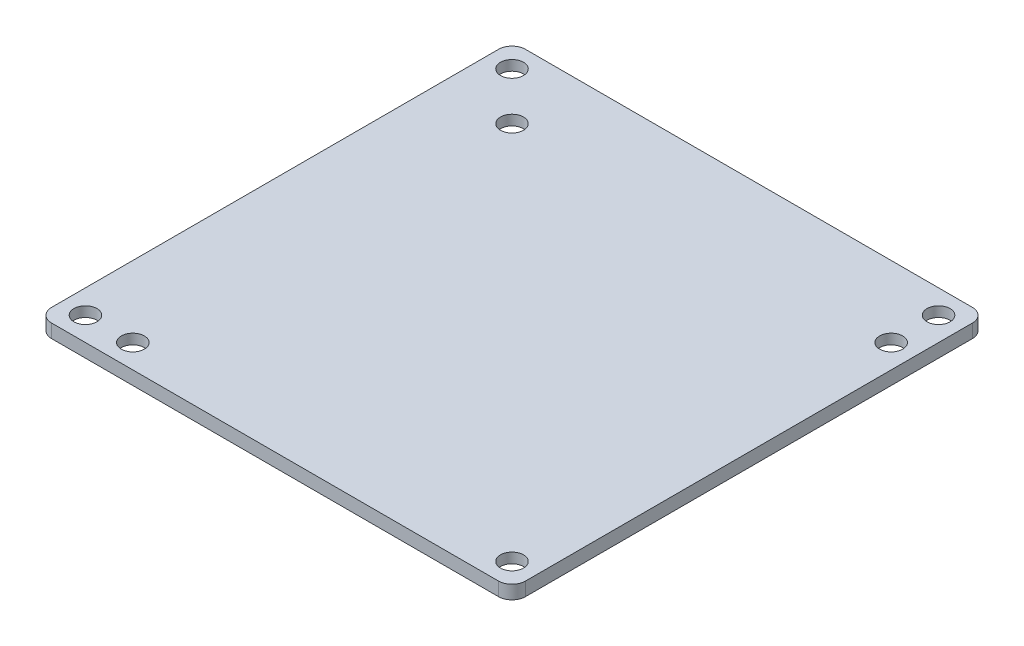
ISO-10303-21;
HEADER;
FILE_DESCRIPTION(('STEP AP214'),'2;1');
FILE_NAME('part.step','',(''),(''),'','','');
FILE_SCHEMA(('AUTOMOTIVE_DESIGN { 1 0 10303 214 1 1 1 1 }'));
ENDSEC;
DATA;
#1=APPLICATION_CONTEXT('core data for automotive mechanical design processes');
#2=APPLICATION_PROTOCOL_DEFINITION('international standard','automotive_design',2000,#1);
#3=PRODUCT_CONTEXT('',#1,'mechanical');
#4=PRODUCT('Part','Part','',(#3));
#5=PRODUCT_RELATED_PRODUCT_CATEGORY('part','',(#4));
#6=PRODUCT_DEFINITION_FORMATION('','',#4);
#7=PRODUCT_DEFINITION_CONTEXT('part definition',#1,'design');
#8=PRODUCT_DEFINITION('design','',#6,#7);
#9=PRODUCT_DEFINITION_SHAPE('','',#8);
#10=(LENGTH_UNIT() NAMED_UNIT(*) SI_UNIT(.MILLI.,.METRE.));
#11=(NAMED_UNIT(*) PLANE_ANGLE_UNIT() SI_UNIT($,.RADIAN.));
#12=(NAMED_UNIT(*) SI_UNIT($,.STERADIAN.) SOLID_ANGLE_UNIT());
#13=UNCERTAINTY_MEASURE_WITH_UNIT(LENGTH_MEASURE(1.E-05),#10,'distance_accuracy_value','');
#14=(GEOMETRIC_REPRESENTATION_CONTEXT(3) GLOBAL_UNCERTAINTY_ASSIGNED_CONTEXT((#13)) GLOBAL_UNIT_ASSIGNED_CONTEXT((#10,
#11,#12)) REPRESENTATION_CONTEXT('',''));
#15=CARTESIAN_POINT('',(0.,0.,0.));
#16=DIRECTION('',(0.,0.,1.));
#17=DIRECTION('',(1.,0.,0.));
#18=AXIS2_PLACEMENT_3D('',#15,#16,#17);
#19=CARTESIAN_POINT('',(-28.,2.,28.));
#20=DIRECTION('',(0.,-1.,0.));
#21=DIRECTION('',(0.,0.,-1.));
#22=AXIS2_PLACEMENT_3D('',#19,#20,#21);
#23=CYLINDRICAL_SURFACE('',#22,1.7);
#24=CARTESIAN_POINT('',(-28.,2.,28.));
#25=DIRECTION('',(0.,1.,0.));
#26=DIRECTION('',(0.,0.,1.));
#27=AXIS2_PLACEMENT_3D('',#24,#25,#26);
#28=CIRCLE('',#27,1.7);
#29=CARTESIAN_POINT('',(-28.,2.,29.7));
#30=VERTEX_POINT('',#29);
#31=EDGE_CURVE('E176',#30,#30,#28,.T.);
#32=ORIENTED_EDGE('',*,*,#31,.T.);
#33=EDGE_LOOP('',(#32));
#34=FACE_BOUND('',#33,.T.);
#35=CARTESIAN_POINT('',(-28.,0.5,28.));
#36=DIRECTION('',(0.,-1.,0.));
#37=DIRECTION('',(0.,0.,-1.));
#38=AXIS2_PLACEMENT_3D('',#35,#36,#37);
#39=CIRCLE('',#38,1.7);
#40=CARTESIAN_POINT('',(-28.,0.5,26.3));
#41=VERTEX_POINT('',#40);
#42=EDGE_CURVE('E207',#41,#41,#39,.F.);
#43=ORIENTED_EDGE('',*,*,#42,.F.);
#44=EDGE_LOOP('',(#43));
#45=FACE_BOUND('',#44,.T.);
#46=ADVANCED_FACE('F36',(#34,#45),#23,.F.);
#47=CARTESIAN_POINT('',(28.,2.,28.));
#48=DIRECTION('',(0.,-1.,0.));
#49=DIRECTION('',(0.,0.,-1.));
#50=AXIS2_PLACEMENT_3D('',#47,#48,#49);
#51=CYLINDRICAL_SURFACE('',#50,1.7);
#52=CARTESIAN_POINT('',(28.,2.,28.));
#53=DIRECTION('',(0.,1.,0.));
#54=DIRECTION('',(0.,0.,1.));
#55=AXIS2_PLACEMENT_3D('',#52,#53,#54);
#56=CIRCLE('',#55,1.7);
#57=CARTESIAN_POINT('',(28.,2.,29.7));
#58=VERTEX_POINT('',#57);
#59=EDGE_CURVE('E181',#58,#58,#56,.T.);
#60=ORIENTED_EDGE('',*,*,#59,.T.);
#61=EDGE_LOOP('',(#60));
#62=FACE_BOUND('',#61,.T.);
#63=CARTESIAN_POINT('',(28.,0.5,28.));
#64=DIRECTION('',(0.,-1.,0.));
#65=DIRECTION('',(0.,0.,-1.));
#66=AXIS2_PLACEMENT_3D('',#63,#64,#65);
#67=CIRCLE('',#66,1.7);
#68=CARTESIAN_POINT('',(28.,0.5,26.3));
#69=VERTEX_POINT('',#68);
#70=EDGE_CURVE('E235',#69,#69,#67,.F.);
#71=ORIENTED_EDGE('',*,*,#70,.F.);
#72=EDGE_LOOP('',(#71));
#73=FACE_BOUND('',#72,.T.);
#74=ADVANCED_FACE('F283',(#62,#73),#51,.F.);
#75=CARTESIAN_POINT('',(28.,2.,-28.));
#76=DIRECTION('',(0.,-1.,0.));
#77=DIRECTION('',(0.,0.,-1.));
#78=AXIS2_PLACEMENT_3D('',#75,#76,#77);
#79=CYLINDRICAL_SURFACE('',#78,1.7);
#80=CARTESIAN_POINT('',(28.,2.,-28.));
#81=DIRECTION('',(0.,1.,0.));
#82=DIRECTION('',(0.,0.,1.));
#83=AXIS2_PLACEMENT_3D('',#80,#81,#82);
#84=CIRCLE('',#83,1.7);
#85=CARTESIAN_POINT('',(28.,2.,-26.3));
#86=VERTEX_POINT('',#85);
#87=EDGE_CURVE('E185',#86,#86,#84,.T.);
#88=ORIENTED_EDGE('',*,*,#87,.T.);
#89=EDGE_LOOP('',(#88));
#90=FACE_BOUND('',#89,.T.);
#91=CARTESIAN_POINT('',(28.,0.5,-28.));
#92=DIRECTION('',(0.,-1.,0.));
#93=DIRECTION('',(0.,0.,-1.));
#94=AXIS2_PLACEMENT_3D('',#91,#92,#93);
#95=CIRCLE('',#94,1.7);
#96=CARTESIAN_POINT('',(28.,0.5,-29.7));
#97=VERTEX_POINT('',#96);
#98=EDGE_CURVE('E226',#97,#97,#95,.F.);
#99=ORIENTED_EDGE('',*,*,#98,.F.);
#100=EDGE_LOOP('',(#99));
#101=FACE_BOUND('',#100,.T.);
#102=ADVANCED_FACE('F273',(#90,#101),#79,.F.);
#103=CARTESIAN_POINT('',(-28.,2.,-28.));
#104=DIRECTION('',(0.,-1.,0.));
#105=DIRECTION('',(0.,0.,-1.));
#106=AXIS2_PLACEMENT_3D('',#103,#104,#105);
#107=CYLINDRICAL_SURFACE('',#106,1.7);
#108=CARTESIAN_POINT('',(-28.,2.,-28.));
#109=DIRECTION('',(0.,1.,0.));
#110=DIRECTION('',(0.,0.,1.));
#111=AXIS2_PLACEMENT_3D('',#108,#109,#110);
#112=CIRCLE('',#111,1.7);
#113=CARTESIAN_POINT('',(-28.,2.,-26.3));
#114=VERTEX_POINT('',#113);
#115=EDGE_CURVE('E189',#114,#114,#112,.T.);
#116=ORIENTED_EDGE('',*,*,#115,.T.);
#117=EDGE_LOOP('',(#116));
#118=FACE_BOUND('',#117,.T.);
#119=CARTESIAN_POINT('',(-28.,0.5,-28.));
#120=DIRECTION('',(0.,-1.,0.));
#121=DIRECTION('',(0.,0.,-1.));
#122=AXIS2_PLACEMENT_3D('',#119,#120,#121);
#123=CIRCLE('',#122,1.7);
#124=CARTESIAN_POINT('',(-28.,0.5,-29.7));
#125=VERTEX_POINT('',#124);
#126=EDGE_CURVE('E261',#125,#125,#123,.F.);
#127=ORIENTED_EDGE('',*,*,#126,.F.);
#128=EDGE_LOOP('',(#127));
#129=FACE_BOUND('',#128,.T.);
#130=ADVANCED_FACE('F270',(#118,#129),#107,.F.);
#131=CARTESIAN_POINT('',(28.,2.,-35.));
#132=DIRECTION('',(0.,-1.,0.));
#133=DIRECTION('',(0.,0.,-1.));
#134=AXIS2_PLACEMENT_3D('',#131,#132,#133);
#135=CYLINDRICAL_SURFACE('',#134,1.7);
#136=CARTESIAN_POINT('',(28.,2.,-35.));
#137=DIRECTION('',(0.,1.,0.));
#138=DIRECTION('',(0.,0.,1.));
#139=AXIS2_PLACEMENT_3D('',#136,#137,#138);
#140=CIRCLE('',#139,1.7);
#141=CARTESIAN_POINT('',(28.,2.,-33.3));
#142=VERTEX_POINT('',#141);
#143=EDGE_CURVE('E194',#142,#142,#140,.T.);
#144=ORIENTED_EDGE('',*,*,#143,.T.);
#145=EDGE_LOOP('',(#144));
#146=FACE_BOUND('',#145,.T.);
#147=CARTESIAN_POINT('',(28.,0.5,-35.));
#148=DIRECTION('',(0.,-1.,0.));
#149=DIRECTION('',(0.,0.,-1.));
#150=AXIS2_PLACEMENT_3D('',#147,#148,#149);
#151=CIRCLE('',#150,1.7);
#152=CARTESIAN_POINT('',(28.,0.5,-36.7));
#153=VERTEX_POINT('',#152);
#154=EDGE_CURVE('E216',#153,#153,#151,.F.);
#155=ORIENTED_EDGE('',*,*,#154,.F.);
#156=EDGE_LOOP('',(#155));
#157=FACE_BOUND('',#156,.T.);
#158=ADVANCED_FACE('F272',(#146,#157),#135,.F.);
#159=CARTESIAN_POINT('',(-35.,2.,28.));
#160=DIRECTION('',(0.,-1.,0.));
#161=DIRECTION('',(0.,0.,-1.));
#162=AXIS2_PLACEMENT_3D('',#159,#160,#161);
#163=CYLINDRICAL_SURFACE('',#162,1.7);
#164=CARTESIAN_POINT('',(-35.,2.,28.));
#165=DIRECTION('',(0.,1.,0.));
#166=DIRECTION('',(0.,0.,-1.));
#167=AXIS2_PLACEMENT_3D('',#164,#165,#166);
#168=CIRCLE('',#167,1.7);
#169=CARTESIAN_POINT('',(-35.,2.,26.3));
#170=VERTEX_POINT('',#169);
#171=EDGE_CURVE('E197',#170,#170,#168,.T.);
#172=ORIENTED_EDGE('',*,*,#171,.T.);
#173=EDGE_LOOP('',(#172));
#174=FACE_BOUND('',#173,.T.);
#175=CARTESIAN_POINT('',(-35.,0.5,28.));
#176=DIRECTION('',(0.,-1.,0.));
#177=DIRECTION('',(0.,0.,-1.));
#178=AXIS2_PLACEMENT_3D('',#175,#176,#177);
#179=CIRCLE('',#178,1.7);
#180=CARTESIAN_POINT('',(-35.,0.5,26.3));
#181=VERTEX_POINT('',#180);
#182=EDGE_CURVE('E244',#181,#181,#179,.F.);
#183=ORIENTED_EDGE('',*,*,#182,.F.);
#184=EDGE_LOOP('',(#183));
#185=FACE_BOUND('',#184,.T.);
#186=ADVANCED_FACE('F280',(#174,#185),#163,.F.);
#187=CARTESIAN_POINT('',(-35.,2.,-35.));
#188=DIRECTION('',(0.,-1.,0.));
#189=DIRECTION('',(0.,0.,-1.));
#190=AXIS2_PLACEMENT_3D('',#187,#188,#189);
#191=CYLINDRICAL_SURFACE('',#190,1.7);
#192=CARTESIAN_POINT('',(-35.,2.,-35.));
#193=DIRECTION('',(0.,1.,0.));
#194=DIRECTION('',(0.,0.,-1.));
#195=AXIS2_PLACEMENT_3D('',#192,#193,#194);
#196=CIRCLE('',#195,1.7);
#197=CARTESIAN_POINT('',(-35.,2.,-36.7));
#198=VERTEX_POINT('',#197);
#199=EDGE_CURVE('E200',#198,#198,#196,.T.);
#200=ORIENTED_EDGE('',*,*,#199,.T.);
#201=EDGE_LOOP('',(#200));
#202=FACE_BOUND('',#201,.T.);
#203=CARTESIAN_POINT('',(-35.,0.5,-35.));
#204=DIRECTION('',(0.,-1.,0.));
#205=DIRECTION('',(0.,0.,-1.));
#206=AXIS2_PLACEMENT_3D('',#203,#204,#205);
#207=CIRCLE('',#206,1.7);
#208=CARTESIAN_POINT('',(-35.,0.5,-36.7));
#209=VERTEX_POINT('',#208);
#210=EDGE_CURVE('E252',#209,#209,#207,.F.);
#211=ORIENTED_EDGE('',*,*,#210,.F.);
#212=EDGE_LOOP('',(#211));
#213=FACE_BOUND('',#212,.T.);
#214=ADVANCED_FACE('F297',(#202,#213),#191,.F.);
#215=CARTESIAN_POINT('',(0.,2.,0.));
#216=DIRECTION('',(0.,1.,0.));
#217=DIRECTION('',(0.,0.,1.));
#218=AXIS2_PLACEMENT_3D('',#215,#216,#217);
#219=PLANE('',#218);
#220=ORIENTED_EDGE('',*,*,#171,.F.);
#221=EDGE_LOOP('',(#220));
#222=FACE_BOUND('',#221,.T.);
#223=ORIENTED_EDGE('',*,*,#115,.F.);
#224=EDGE_LOOP('',(#223));
#225=FACE_BOUND('',#224,.T.);
#226=ORIENTED_EDGE('',*,*,#59,.F.);
#227=EDGE_LOOP('',(#226));
#228=FACE_BOUND('',#227,.T.);
#229=DIRECTION('',(1.,0.,0.));
#230=VECTOR('',#229,1.);
#231=CARTESIAN_POINT('',(-38.5,2.,31.5));
#232=LINE('',#231,#230);
#233=CARTESIAN_POINT('',(-36.5,2.,31.5));
#234=VERTEX_POINT('',#233);
#235=CARTESIAN_POINT('',(29.5,2.,31.5));
#236=VERTEX_POINT('',#235);
#237=EDGE_CURVE('E171',#234,#236,#232,.T.);
#238=ORIENTED_EDGE('',*,*,#237,.T.);
#239=CARTESIAN_POINT('',(29.5,2.,29.5));
#240=DIRECTION('',(0.,1.,0.));
#241=DIRECTION('',(0.,0.,1.));
#242=AXIS2_PLACEMENT_3D('',#239,#240,#241);
#243=CIRCLE('',#242,2.);
#244=CARTESIAN_POINT('',(31.5,2.,29.5));
#245=VERTEX_POINT('',#244);
#246=EDGE_CURVE('E149',#236,#245,#243,.T.);
#247=ORIENTED_EDGE('',*,*,#246,.T.);
#248=DIRECTION('',(0.,0.,-1.));
#249=VECTOR('',#248,1.);
#250=CARTESIAN_POINT('',(31.5,2.,-38.5));
#251=LINE('',#250,#249);
#252=CARTESIAN_POINT('',(31.5,2.,-36.5));
#253=VERTEX_POINT('',#252);
#254=EDGE_CURVE('E120',#245,#253,#251,.T.);
#255=ORIENTED_EDGE('',*,*,#254,.T.);
#256=CARTESIAN_POINT('',(29.5,2.,-36.5));
#257=DIRECTION('',(0.,1.,0.));
#258=DIRECTION('',(0.,0.,1.));
#259=AXIS2_PLACEMENT_3D('',#256,#257,#258);
#260=CIRCLE('',#259,2.);
#261=CARTESIAN_POINT('',(29.5,2.,-38.5));
#262=VERTEX_POINT('',#261);
#263=EDGE_CURVE('E56',#253,#262,#260,.T.);
#264=ORIENTED_EDGE('',*,*,#263,.T.);
#265=DIRECTION('',(-1.,0.,0.));
#266=VECTOR('',#265,1.);
#267=CARTESIAN_POINT('',(-38.5,2.,-38.5));
#268=LINE('',#267,#266);
#269=CARTESIAN_POINT('',(-36.5,2.,-38.5));
#270=VERTEX_POINT('',#269);
#271=EDGE_CURVE('E135',#262,#270,#268,.T.);
#272=ORIENTED_EDGE('',*,*,#271,.T.);
#273=CARTESIAN_POINT('',(-36.5,2.,-36.5));
#274=DIRECTION('',(0.,1.,0.));
#275=DIRECTION('',(0.,0.,1.));
#276=AXIS2_PLACEMENT_3D('',#273,#274,#275);
#277=CIRCLE('',#276,2.);
#278=CARTESIAN_POINT('',(-38.5,2.,-36.5));
#279=VERTEX_POINT('',#278);
#280=EDGE_CURVE('E145',#270,#279,#277,.T.);
#281=ORIENTED_EDGE('',*,*,#280,.T.);
#282=DIRECTION('',(0.,0.,1.));
#283=VECTOR('',#282,1.);
#284=CARTESIAN_POINT('',(-38.5,2.,-38.5));
#285=LINE('',#284,#283);
#286=CARTESIAN_POINT('',(-38.5,2.,29.5));
#287=VERTEX_POINT('',#286);
#288=EDGE_CURVE('E129',#279,#287,#285,.T.);
#289=ORIENTED_EDGE('',*,*,#288,.T.);
#290=CARTESIAN_POINT('',(-36.5,2.,29.5));
#291=DIRECTION('',(0.,1.,0.));
#292=DIRECTION('',(0.,0.,1.));
#293=AXIS2_PLACEMENT_3D('',#290,#291,#292);
#294=CIRCLE('',#293,2.);
#295=EDGE_CURVE('E147',#287,#234,#294,.T.);
#296=ORIENTED_EDGE('',*,*,#295,.T.);
#297=EDGE_LOOP('',(#238,#247,#255,#264,#272,#281,#289,#296));
#298=FACE_BOUND('',#297,.T.);
#299=ORIENTED_EDGE('',*,*,#31,.F.);
#300=EDGE_LOOP('',(#299));
#301=FACE_BOUND('',#300,.T.);
#302=ORIENTED_EDGE('',*,*,#87,.F.);
#303=EDGE_LOOP('',(#302));
#304=FACE_BOUND('',#303,.T.);
#305=ORIENTED_EDGE('',*,*,#143,.F.);
#306=EDGE_LOOP('',(#305));
#307=FACE_BOUND('',#306,.T.);
#308=ORIENTED_EDGE('',*,*,#199,.F.);
#309=EDGE_LOOP('',(#308));
#310=FACE_BOUND('',#309,.T.);
#311=ADVANCED_FACE('F294',(#222,#225,#228,#298,#301,#304,#307,#310),#219,.T.);
#312=CARTESIAN_POINT('',(0.,0.,0.));
#313=DIRECTION('',(0.,1.,0.));
#314=DIRECTION('',(0.,0.,1.));
#315=AXIS2_PLACEMENT_3D('',#312,#313,#314);
#316=PLANE('',#315);
#317=CARTESIAN_POINT('',(-35.,0.,28.));
#318=DIRECTION('',(0.,-1.,0.));
#319=DIRECTION('',(0.,0.,-1.));
#320=AXIS2_PLACEMENT_3D('',#317,#318,#319);
#321=CIRCLE('',#320,2.5);
#322=CARTESIAN_POINT('',(-35.,0.,25.5));
#323=VERTEX_POINT('',#322);
#324=EDGE_CURVE('E239',#323,#323,#321,.T.);
#325=ORIENTED_EDGE('',*,*,#324,.F.);
#326=EDGE_LOOP('',(#325));
#327=FACE_BOUND('',#326,.T.);
#328=CARTESIAN_POINT('',(28.,0.,28.));
#329=DIRECTION('',(0.,-1.,0.));
#330=DIRECTION('',(0.,0.,-1.));
#331=AXIS2_PLACEMENT_3D('',#328,#329,#330);
#332=CIRCLE('',#331,2.5);
#333=CARTESIAN_POINT('',(28.,0.,25.5));
#334=VERTEX_POINT('',#333);
#335=EDGE_CURVE('E230',#334,#334,#332,.T.);
#336=ORIENTED_EDGE('',*,*,#335,.F.);
#337=EDGE_LOOP('',(#336));
#338=FACE_BOUND('',#337,.T.);
#339=CARTESIAN_POINT('',(28.,0.,-28.));
#340=DIRECTION('',(0.,-1.,0.));
#341=DIRECTION('',(0.,0.,-1.));
#342=AXIS2_PLACEMENT_3D('',#339,#340,#341);
#343=CIRCLE('',#342,2.5);
#344=CARTESIAN_POINT('',(28.,0.,-30.5));
#345=VERTEX_POINT('',#344);
#346=EDGE_CURVE('E221',#345,#345,#343,.T.);
#347=ORIENTED_EDGE('',*,*,#346,.F.);
#348=EDGE_LOOP('',(#347));
#349=FACE_BOUND('',#348,.T.);
#350=CARTESIAN_POINT('',(28.,0.,-35.));
#351=DIRECTION('',(0.,-1.,0.));
#352=DIRECTION('',(0.,0.,-1.));
#353=AXIS2_PLACEMENT_3D('',#350,#351,#352);
#354=CIRCLE('',#353,2.5);
#355=CARTESIAN_POINT('',(28.,0.,-37.5));
#356=VERTEX_POINT('',#355);
#357=EDGE_CURVE('E213',#356,#356,#354,.T.);
#358=ORIENTED_EDGE('',*,*,#357,.F.);
#359=EDGE_LOOP('',(#358));
#360=FACE_BOUND('',#359,.T.);
#361=CARTESIAN_POINT('',(-28.,0.,-28.));
#362=DIRECTION('',(0.,-1.,0.));
#363=DIRECTION('',(0.,0.,-1.));
#364=AXIS2_PLACEMENT_3D('',#361,#362,#363);
#365=CIRCLE('',#364,2.5);
#366=CARTESIAN_POINT('',(-28.,0.,-30.5));
#367=VERTEX_POINT('',#366);
#368=EDGE_CURVE('E256',#367,#367,#365,.T.);
#369=ORIENTED_EDGE('',*,*,#368,.F.);
#370=EDGE_LOOP('',(#369));
#371=FACE_BOUND('',#370,.T.);
#372=CARTESIAN_POINT('',(-35.,0.,-35.));
#373=DIRECTION('',(0.,-1.,0.));
#374=DIRECTION('',(0.,0.,-1.));
#375=AXIS2_PLACEMENT_3D('',#372,#373,#374);
#376=CIRCLE('',#375,2.5);
#377=CARTESIAN_POINT('',(-35.,0.,-37.5));
#378=VERTEX_POINT('',#377);
#379=EDGE_CURVE('E249',#378,#378,#376,.T.);
#380=ORIENTED_EDGE('',*,*,#379,.F.);
#381=EDGE_LOOP('',(#380));
#382=FACE_BOUND('',#381,.T.);
#383=CARTESIAN_POINT('',(-28.,0.,28.));
#384=DIRECTION('',(0.,-1.,0.));
#385=DIRECTION('',(0.,0.,-1.));
#386=AXIS2_PLACEMENT_3D('',#383,#384,#385);
#387=CIRCLE('',#386,2.5);
#388=CARTESIAN_POINT('',(-28.,0.,25.5));
#389=VERTEX_POINT('',#388);
#390=EDGE_CURVE('E204',#389,#389,#387,.T.);
#391=ORIENTED_EDGE('',*,*,#390,.F.);
#392=EDGE_LOOP('',(#391));
#393=FACE_BOUND('',#392,.T.);
#394=DIRECTION('',(0.,0.,-1.));
#395=VECTOR('',#394,1.);
#396=CARTESIAN_POINT('',(31.5,0.,-38.5));
#397=LINE('',#396,#395);
#398=CARTESIAN_POINT('',(31.5,0.,29.5));
#399=VERTEX_POINT('',#398);
#400=CARTESIAN_POINT('',(31.5,0.,-36.5));
#401=VERTEX_POINT('',#400);
#402=EDGE_CURVE('E118',#399,#401,#397,.T.);
#403=ORIENTED_EDGE('',*,*,#402,.F.);
#404=CARTESIAN_POINT('',(29.5,0.,29.5));
#405=DIRECTION('',(0.,1.,0.));
#406=DIRECTION('',(0.,0.,1.));
#407=AXIS2_PLACEMENT_3D('',#404,#405,#406);
#408=CIRCLE('',#407,2.);
#409=CARTESIAN_POINT('',(29.5,0.,31.5));
#410=VERTEX_POINT('',#409);
#411=EDGE_CURVE('E101',#399,#410,#408,.F.);
#412=ORIENTED_EDGE('',*,*,#411,.T.);
#413=DIRECTION('',(1.,0.,0.));
#414=VECTOR('',#413,1.);
#415=CARTESIAN_POINT('',(-38.5,0.,31.5));
#416=LINE('',#415,#414);
#417=CARTESIAN_POINT('',(-36.5,0.,31.5));
#418=VERTEX_POINT('',#417);
#419=EDGE_CURVE('E127',#418,#410,#416,.T.);
#420=ORIENTED_EDGE('',*,*,#419,.F.);
#421=CARTESIAN_POINT('',(-36.5,0.,29.5));
#422=DIRECTION('',(0.,1.,0.));
#423=DIRECTION('',(0.,0.,1.));
#424=AXIS2_PLACEMENT_3D('',#421,#422,#423);
#425=CIRCLE('',#424,2.);
#426=CARTESIAN_POINT('',(-38.5,0.,29.5));
#427=VERTEX_POINT('',#426);
#428=EDGE_CURVE('E112',#418,#427,#425,.F.);
#429=ORIENTED_EDGE('',*,*,#428,.T.);
#430=DIRECTION('',(0.,0.,1.));
#431=VECTOR('',#430,1.);
#432=CARTESIAN_POINT('',(-38.5,0.,-38.5));
#433=LINE('',#432,#431);
#434=CARTESIAN_POINT('',(-38.5,0.,-36.5));
#435=VERTEX_POINT('',#434);
#436=EDGE_CURVE('E131',#435,#427,#433,.T.);
#437=ORIENTED_EDGE('',*,*,#436,.F.);
#438=CARTESIAN_POINT('',(-36.5,0.,-36.5));
#439=DIRECTION('',(0.,1.,0.));
#440=DIRECTION('',(0.,0.,1.));
#441=AXIS2_PLACEMENT_3D('',#438,#439,#440);
#442=CIRCLE('',#441,2.);
#443=CARTESIAN_POINT('',(-36.5,0.,-38.5));
#444=VERTEX_POINT('',#443);
#445=EDGE_CURVE('E138',#435,#444,#442,.F.);
#446=ORIENTED_EDGE('',*,*,#445,.T.);
#447=DIRECTION('',(-1.,0.,0.));
#448=VECTOR('',#447,1.);
#449=CARTESIAN_POINT('',(-38.5,0.,-38.5));
#450=LINE('',#449,#448);
#451=CARTESIAN_POINT('',(29.5,0.,-38.5));
#452=VERTEX_POINT('',#451);
#453=EDGE_CURVE('E126',#452,#444,#450,.T.);
#454=ORIENTED_EDGE('',*,*,#453,.F.);
#455=CARTESIAN_POINT('',(29.5,0.,-36.5));
#456=DIRECTION('',(0.,1.,0.));
#457=DIRECTION('',(0.,0.,1.));
#458=AXIS2_PLACEMENT_3D('',#455,#456,#457);
#459=CIRCLE('',#458,2.);
#460=EDGE_CURVE('E121',#452,#401,#459,.F.);
#461=ORIENTED_EDGE('',*,*,#460,.T.);
#462=EDGE_LOOP('',(#403,#412,#420,#429,#437,#446,#454,#461));
#463=FACE_BOUND('',#462,.T.);
#464=ADVANCED_FACE('F124',(#327,#338,#349,#360,#371,#382,#393,#463),#316,.F.);
#465=CARTESIAN_POINT('',(-38.5,2.,-38.5));
#466=DIRECTION('',(1.,0.,0.));
#467=DIRECTION('',(0.,0.,-1.));
#468=AXIS2_PLACEMENT_3D('',#465,#466,#467);
#469=PLANE('',#468);
#470=ORIENTED_EDGE('',*,*,#436,.T.);
#471=DIRECTION('',(0.,-1.,0.));
#472=VECTOR('',#471,1.);
#473=CARTESIAN_POINT('',(-38.5,2.,29.5));
#474=LINE('',#473,#472);
#475=EDGE_CURVE('E154',#427,#287,#474,.F.);
#476=ORIENTED_EDGE('',*,*,#475,.T.);
#477=ORIENTED_EDGE('',*,*,#288,.F.);
#478=DIRECTION('',(0.,-1.,0.));
#479=VECTOR('',#478,1.);
#480=CARTESIAN_POINT('',(-38.5,2.,-36.5));
#481=LINE('',#480,#479);
#482=EDGE_CURVE('E151',#279,#435,#481,.T.);
#483=ORIENTED_EDGE('',*,*,#482,.T.);
#484=EDGE_LOOP('',(#470,#476,#477,#483));
#485=FACE_BOUND('',#484,.T.);
#486=ADVANCED_FACE('F167',(#485),#469,.F.);
#487=CARTESIAN_POINT('',(-38.5,2.,31.5));
#488=DIRECTION('',(0.,0.,-1.));
#489=DIRECTION('',(-1.,0.,0.));
#490=AXIS2_PLACEMENT_3D('',#487,#488,#489);
#491=PLANE('',#490);
#492=ORIENTED_EDGE('',*,*,#419,.T.);
#493=DIRECTION('',(0.,-1.,0.));
#494=VECTOR('',#493,1.);
#495=CARTESIAN_POINT('',(29.5,2.,31.5));
#496=LINE('',#495,#494);
#497=EDGE_CURVE('E106',#410,#236,#496,.F.);
#498=ORIENTED_EDGE('',*,*,#497,.T.);
#499=ORIENTED_EDGE('',*,*,#237,.F.);
#500=DIRECTION('',(0.,-1.,0.));
#501=VECTOR('',#500,1.);
#502=CARTESIAN_POINT('',(-36.5,2.,31.5));
#503=LINE('',#502,#501);
#504=EDGE_CURVE('E111',#234,#418,#503,.T.);
#505=ORIENTED_EDGE('',*,*,#504,.T.);
#506=EDGE_LOOP('',(#492,#498,#499,#505));
#507=FACE_BOUND('',#506,.T.);
#508=ADVANCED_FACE('F306',(#507),#491,.F.);
#509=CARTESIAN_POINT('',(31.5,2.,-38.5));
#510=DIRECTION('',(-1.,0.,0.));
#511=DIRECTION('',(0.,0.,1.));
#512=AXIS2_PLACEMENT_3D('',#509,#510,#511);
#513=PLANE('',#512);
#514=ORIENTED_EDGE('',*,*,#254,.F.);
#515=DIRECTION('',(0.,-1.,0.));
#516=VECTOR('',#515,1.);
#517=CARTESIAN_POINT('',(31.5,2.,29.5));
#518=LINE('',#517,#516);
#519=EDGE_CURVE('E105',#245,#399,#518,.T.);
#520=ORIENTED_EDGE('',*,*,#519,.T.);
#521=ORIENTED_EDGE('',*,*,#402,.T.);
#522=DIRECTION('',(0.,-1.,0.));
#523=VECTOR('',#522,1.);
#524=CARTESIAN_POINT('',(31.5,2.,-36.5));
#525=LINE('',#524,#523);
#526=EDGE_CURVE('E122',#401,#253,#525,.F.);
#527=ORIENTED_EDGE('',*,*,#526,.T.);
#528=EDGE_LOOP('',(#514,#520,#521,#527));
#529=FACE_BOUND('',#528,.T.);
#530=ADVANCED_FACE('F117',(#529),#513,.F.);
#531=CARTESIAN_POINT('',(-38.5,2.,-38.5));
#532=DIRECTION('',(0.,0.,1.));
#533=DIRECTION('',(1.,0.,0.));
#534=AXIS2_PLACEMENT_3D('',#531,#532,#533);
#535=PLANE('',#534);
#536=ORIENTED_EDGE('',*,*,#453,.T.);
#537=DIRECTION('',(0.,-1.,0.));
#538=VECTOR('',#537,1.);
#539=CARTESIAN_POINT('',(-36.5,2.,-38.5));
#540=LINE('',#539,#538);
#541=EDGE_CURVE('E11',#444,#270,#540,.F.);
#542=ORIENTED_EDGE('',*,*,#541,.T.);
#543=ORIENTED_EDGE('',*,*,#271,.F.);
#544=DIRECTION('',(0.,-1.,0.));
#545=VECTOR('',#544,1.);
#546=CARTESIAN_POINT('',(29.5,2.,-38.5));
#547=LINE('',#546,#545);
#548=EDGE_CURVE('E44',#262,#452,#547,.T.);
#549=ORIENTED_EDGE('',*,*,#548,.T.);
#550=EDGE_LOOP('',(#536,#542,#543,#549));
#551=FACE_BOUND('',#550,.T.);
#552=ADVANCED_FACE('F157',(#551),#535,.F.);
#553=CARTESIAN_POINT('',(29.5,2.,29.5));
#554=DIRECTION('',(0.,-1.,0.));
#555=DIRECTION('',(0.,0.,-1.));
#556=AXIS2_PLACEMENT_3D('',#553,#554,#555);
#557=CYLINDRICAL_SURFACE('',#556,2.);
#558=ORIENTED_EDGE('',*,*,#246,.F.);
#559=ORIENTED_EDGE('',*,*,#497,.F.);
#560=ORIENTED_EDGE('',*,*,#411,.F.);
#561=ORIENTED_EDGE('',*,*,#519,.F.);
#562=EDGE_LOOP('',(#558,#559,#560,#561));
#563=FACE_BOUND('',#562,.T.);
#564=ADVANCED_FACE('F104',(#563),#557,.T.);
#565=CARTESIAN_POINT('',(-36.5,2.,29.5));
#566=DIRECTION('',(0.,-1.,0.));
#567=DIRECTION('',(0.,0.,-1.));
#568=AXIS2_PLACEMENT_3D('',#565,#566,#567);
#569=CYLINDRICAL_SURFACE('',#568,2.);
#570=ORIENTED_EDGE('',*,*,#295,.F.);
#571=ORIENTED_EDGE('',*,*,#475,.F.);
#572=ORIENTED_EDGE('',*,*,#428,.F.);
#573=ORIENTED_EDGE('',*,*,#504,.F.);
#574=EDGE_LOOP('',(#570,#571,#572,#573));
#575=FACE_BOUND('',#574,.T.);
#576=ADVANCED_FACE('F314',(#575),#569,.T.);
#577=CARTESIAN_POINT('',(-36.5,2.,-36.5));
#578=DIRECTION('',(0.,-1.,0.));
#579=DIRECTION('',(0.,0.,-1.));
#580=AXIS2_PLACEMENT_3D('',#577,#578,#579);
#581=CYLINDRICAL_SURFACE('',#580,2.);
#582=ORIENTED_EDGE('',*,*,#280,.F.);
#583=ORIENTED_EDGE('',*,*,#541,.F.);
#584=ORIENTED_EDGE('',*,*,#445,.F.);
#585=ORIENTED_EDGE('',*,*,#482,.F.);
#586=EDGE_LOOP('',(#582,#583,#584,#585));
#587=FACE_BOUND('',#586,.T.);
#588=ADVANCED_FACE('F164',(#587),#581,.T.);
#589=CARTESIAN_POINT('',(29.5,2.,-36.5));
#590=DIRECTION('',(0.,-1.,0.));
#591=DIRECTION('',(0.,0.,-1.));
#592=AXIS2_PLACEMENT_3D('',#589,#590,#591);
#593=CYLINDRICAL_SURFACE('',#592,2.);
#594=ORIENTED_EDGE('',*,*,#263,.F.);
#595=ORIENTED_EDGE('',*,*,#526,.F.);
#596=ORIENTED_EDGE('',*,*,#460,.F.);
#597=ORIENTED_EDGE('',*,*,#548,.F.);
#598=EDGE_LOOP('',(#594,#595,#596,#597));
#599=FACE_BOUND('',#598,.T.);
#600=ADVANCED_FACE('F38',(#599),#593,.T.);
#601=CARTESIAN_POINT('',(-35.,0.5,-35.));
#602=DIRECTION('',(0.,-1.,0.));
#603=DIRECTION('',(0.,0.,-1.));
#604=AXIS2_PLACEMENT_3D('',#601,#602,#603);
#605=CYLINDRICAL_SURFACE('',#604,2.5);
#606=CARTESIAN_POINT('',(-35.,0.5,-35.));
#607=DIRECTION('',(0.,-1.,0.));
#608=DIRECTION('',(0.,0.,-1.));
#609=AXIS2_PLACEMENT_3D('',#606,#607,#608);
#610=CIRCLE('',#609,2.5);
#611=CARTESIAN_POINT('',(-35.,0.5,-37.5));
#612=VERTEX_POINT('',#611);
#613=EDGE_CURVE('E253',#612,#612,#610,.T.);
#614=ORIENTED_EDGE('',*,*,#613,.F.);
#615=EDGE_LOOP('',(#614));
#616=FACE_BOUND('',#615,.T.);
#617=ORIENTED_EDGE('',*,*,#379,.T.);
#618=EDGE_LOOP('',(#617));
#619=FACE_BOUND('',#618,.T.);
#620=ADVANCED_FACE('F321',(#616,#619),#605,.F.);
#621=CARTESIAN_POINT('',(0.,0.5,0.));
#622=DIRECTION('',(0.,-1.,0.));
#623=DIRECTION('',(0.,0.,-1.));
#624=AXIS2_PLACEMENT_3D('',#621,#622,#623);
#625=PLANE('',#624);
#626=ORIENTED_EDGE('',*,*,#210,.T.);
#627=EDGE_LOOP('',(#626));
#628=FACE_BOUND('',#627,.T.);
#629=ORIENTED_EDGE('',*,*,#613,.T.);
#630=EDGE_LOOP('',(#629));
#631=FACE_BOUND('',#630,.T.);
#632=ADVANCED_FACE('F325',(#628,#631),#625,.T.);
#633=CARTESIAN_POINT('',(-35.,0.5,28.));
#634=DIRECTION('',(0.,-1.,0.));
#635=DIRECTION('',(0.,0.,-1.));
#636=AXIS2_PLACEMENT_3D('',#633,#634,#635);
#637=CYLINDRICAL_SURFACE('',#636,2.5);
#638=CARTESIAN_POINT('',(-35.,0.5,28.));
#639=DIRECTION('',(0.,-1.,0.));
#640=DIRECTION('',(0.,0.,-1.));
#641=AXIS2_PLACEMENT_3D('',#638,#639,#640);
#642=CIRCLE('',#641,2.5);
#643=CARTESIAN_POINT('',(-35.,0.5,25.5));
#644=VERTEX_POINT('',#643);
#645=EDGE_CURVE('E208',#644,#644,#642,.T.);
#646=ORIENTED_EDGE('',*,*,#645,.F.);
#647=EDGE_LOOP('',(#646));
#648=FACE_BOUND('',#647,.T.);
#649=ORIENTED_EDGE('',*,*,#324,.T.);
#650=EDGE_LOOP('',(#649));
#651=FACE_BOUND('',#650,.T.);
#652=ADVANCED_FACE('F345',(#648,#651),#637,.F.);
#653=CARTESIAN_POINT('',(0.,0.5,0.));
#654=DIRECTION('',(0.,-1.,0.));
#655=DIRECTION('',(0.,0.,-1.));
#656=AXIS2_PLACEMENT_3D('',#653,#654,#655);
#657=PLANE('',#656);
#658=ORIENTED_EDGE('',*,*,#182,.T.);
#659=EDGE_LOOP('',(#658));
#660=FACE_BOUND('',#659,.T.);
#661=ORIENTED_EDGE('',*,*,#645,.T.);
#662=EDGE_LOOP('',(#661));
#663=FACE_BOUND('',#662,.T.);
#664=ADVANCED_FACE('F380',(#660,#663),#657,.T.);
#665=CARTESIAN_POINT('',(28.,0.5,-35.));
#666=DIRECTION('',(0.,-1.,0.));
#667=DIRECTION('',(0.,0.,-1.));
#668=AXIS2_PLACEMENT_3D('',#665,#666,#667);
#669=CYLINDRICAL_SURFACE('',#668,2.5);
#670=CARTESIAN_POINT('',(28.,0.5,-35.));
#671=DIRECTION('',(0.,-1.,0.));
#672=DIRECTION('',(0.,0.,-1.));
#673=AXIS2_PLACEMENT_3D('',#670,#671,#672);
#674=CIRCLE('',#673,2.5);
#675=CARTESIAN_POINT('',(28.,0.5,-37.5));
#676=VERTEX_POINT('',#675);
#677=EDGE_CURVE('E218',#676,#676,#674,.T.);
#678=ORIENTED_EDGE('',*,*,#677,.F.);
#679=EDGE_LOOP('',(#678));
#680=FACE_BOUND('',#679,.T.);
#681=ORIENTED_EDGE('',*,*,#357,.T.);
#682=EDGE_LOOP('',(#681));
#683=FACE_BOUND('',#682,.T.);
#684=ADVANCED_FACE('F383',(#680,#683),#669,.F.);
#685=CARTESIAN_POINT('',(0.,0.5,0.));
#686=DIRECTION('',(0.,-1.,0.));
#687=DIRECTION('',(0.,0.,-1.));
#688=AXIS2_PLACEMENT_3D('',#685,#686,#687);
#689=PLANE('',#688);
#690=ORIENTED_EDGE('',*,*,#154,.T.);
#691=EDGE_LOOP('',(#690));
#692=FACE_BOUND('',#691,.T.);
#693=ORIENTED_EDGE('',*,*,#677,.T.);
#694=EDGE_LOOP('',(#693));
#695=FACE_BOUND('',#694,.T.);
#696=ADVANCED_FACE('F402',(#692,#695),#689,.T.);
#697=CARTESIAN_POINT('',(-28.,0.5,-28.));
#698=DIRECTION('',(0.,-1.,0.));
#699=DIRECTION('',(0.,0.,-1.));
#700=AXIS2_PLACEMENT_3D('',#697,#698,#699);
#701=CYLINDRICAL_SURFACE('',#700,2.5);
#702=CARTESIAN_POINT('',(-28.,0.5,-28.));
#703=DIRECTION('',(0.,-1.,0.));
#704=DIRECTION('',(0.,0.,-1.));
#705=AXIS2_PLACEMENT_3D('',#702,#703,#704);
#706=CIRCLE('',#705,2.5);
#707=CARTESIAN_POINT('',(-28.,0.5,-30.5));
#708=VERTEX_POINT('',#707);
#709=EDGE_CURVE('E217',#708,#708,#706,.T.);
#710=ORIENTED_EDGE('',*,*,#709,.F.);
#711=EDGE_LOOP('',(#710));
#712=FACE_BOUND('',#711,.T.);
#713=ORIENTED_EDGE('',*,*,#368,.T.);
#714=EDGE_LOOP('',(#713));
#715=FACE_BOUND('',#714,.T.);
#716=ADVANCED_FACE('F400',(#712,#715),#701,.F.);
#717=CARTESIAN_POINT('',(0.,0.5,0.));
#718=DIRECTION('',(0.,-1.,0.));
#719=DIRECTION('',(0.,0.,-1.));
#720=AXIS2_PLACEMENT_3D('',#717,#718,#719);
#721=PLANE('',#720);
#722=ORIENTED_EDGE('',*,*,#126,.T.);
#723=EDGE_LOOP('',(#722));
#724=FACE_BOUND('',#723,.T.);
#725=ORIENTED_EDGE('',*,*,#709,.T.);
#726=EDGE_LOOP('',(#725));
#727=FACE_BOUND('',#726,.T.);
#728=ADVANCED_FACE('F267',(#724,#727),#721,.T.);
#729=CARTESIAN_POINT('',(28.,0.5,-28.));
#730=DIRECTION('',(0.,-1.,0.));
#731=DIRECTION('',(0.,0.,-1.));
#732=AXIS2_PLACEMENT_3D('',#729,#730,#731);
#733=CYLINDRICAL_SURFACE('',#732,2.5);
#734=CARTESIAN_POINT('',(28.,0.5,-28.));
#735=DIRECTION('',(0.,-1.,0.));
#736=DIRECTION('',(0.,0.,-1.));
#737=AXIS2_PLACEMENT_3D('',#734,#735,#736);
#738=CIRCLE('',#737,2.5);
#739=CARTESIAN_POINT('',(28.,0.5,-30.5));
#740=VERTEX_POINT('',#739);
#741=EDGE_CURVE('E227',#740,#740,#738,.T.);
#742=ORIENTED_EDGE('',*,*,#741,.F.);
#743=EDGE_LOOP('',(#742));
#744=FACE_BOUND('',#743,.T.);
#745=ORIENTED_EDGE('',*,*,#346,.T.);
#746=EDGE_LOOP('',(#745));
#747=FACE_BOUND('',#746,.T.);
#748=ADVANCED_FACE('F409',(#744,#747),#733,.F.);
#749=CARTESIAN_POINT('',(0.,0.5,0.));
#750=DIRECTION('',(0.,-1.,0.));
#751=DIRECTION('',(0.,0.,-1.));
#752=AXIS2_PLACEMENT_3D('',#749,#750,#751);
#753=PLANE('',#752);
#754=ORIENTED_EDGE('',*,*,#98,.T.);
#755=EDGE_LOOP('',(#754));
#756=FACE_BOUND('',#755,.T.);
#757=ORIENTED_EDGE('',*,*,#741,.T.);
#758=EDGE_LOOP('',(#757));
#759=FACE_BOUND('',#758,.T.);
#760=ADVANCED_FACE('F417',(#756,#759),#753,.T.);
#761=CARTESIAN_POINT('',(28.,0.5,28.));
#762=DIRECTION('',(0.,-1.,0.));
#763=DIRECTION('',(0.,0.,-1.));
#764=AXIS2_PLACEMENT_3D('',#761,#762,#763);
#765=CYLINDRICAL_SURFACE('',#764,2.5);
#766=CARTESIAN_POINT('',(28.,0.5,28.));
#767=DIRECTION('',(0.,-1.,0.));
#768=DIRECTION('',(0.,0.,-1.));
#769=AXIS2_PLACEMENT_3D('',#766,#767,#768);
#770=CIRCLE('',#769,2.5);
#771=CARTESIAN_POINT('',(28.,0.5,25.5));
#772=VERTEX_POINT('',#771);
#773=EDGE_CURVE('E236',#772,#772,#770,.T.);
#774=ORIENTED_EDGE('',*,*,#773,.F.);
#775=EDGE_LOOP('',(#774));
#776=FACE_BOUND('',#775,.T.);
#777=ORIENTED_EDGE('',*,*,#335,.T.);
#778=EDGE_LOOP('',(#777));
#779=FACE_BOUND('',#778,.T.);
#780=ADVANCED_FACE('F366',(#776,#779),#765,.F.);
#781=CARTESIAN_POINT('',(0.,0.5,0.));
#782=DIRECTION('',(0.,-1.,0.));
#783=DIRECTION('',(0.,0.,-1.));
#784=AXIS2_PLACEMENT_3D('',#781,#782,#783);
#785=PLANE('',#784);
#786=ORIENTED_EDGE('',*,*,#70,.T.);
#787=EDGE_LOOP('',(#786));
#788=FACE_BOUND('',#787,.T.);
#789=ORIENTED_EDGE('',*,*,#773,.T.);
#790=EDGE_LOOP('',(#789));
#791=FACE_BOUND('',#790,.T.);
#792=ADVANCED_FACE('F357',(#788,#791),#785,.T.);
#793=CARTESIAN_POINT('',(-28.,0.5,28.));
#794=DIRECTION('',(0.,-1.,0.));
#795=DIRECTION('',(0.,0.,-1.));
#796=AXIS2_PLACEMENT_3D('',#793,#794,#795);
#797=CYLINDRICAL_SURFACE('',#796,2.5);
#798=CARTESIAN_POINT('',(-28.,0.5,28.));
#799=DIRECTION('',(0.,-1.,0.));
#800=DIRECTION('',(0.,0.,-1.));
#801=AXIS2_PLACEMENT_3D('',#798,#799,#800);
#802=CIRCLE('',#801,2.5);
#803=CARTESIAN_POINT('',(-28.,0.5,25.5));
#804=VERTEX_POINT('',#803);
#805=EDGE_CURVE('E203',#804,#804,#802,.T.);
#806=ORIENTED_EDGE('',*,*,#805,.F.);
#807=EDGE_LOOP('',(#806));
#808=FACE_BOUND('',#807,.T.);
#809=ORIENTED_EDGE('',*,*,#390,.T.);
#810=EDGE_LOOP('',(#809));
#811=FACE_BOUND('',#810,.T.);
#812=ADVANCED_FACE('F354',(#808,#811),#797,.F.);
#813=CARTESIAN_POINT('',(0.,0.5,0.));
#814=DIRECTION('',(0.,-1.,0.));
#815=DIRECTION('',(0.,0.,-1.));
#816=AXIS2_PLACEMENT_3D('',#813,#814,#815);
#817=PLANE('',#816);
#818=ORIENTED_EDGE('',*,*,#42,.T.);
#819=EDGE_LOOP('',(#818));
#820=FACE_BOUND('',#819,.T.);
#821=ORIENTED_EDGE('',*,*,#805,.T.);
#822=EDGE_LOOP('',(#821));
#823=FACE_BOUND('',#822,.T.);
#824=ADVANCED_FACE('F356',(#820,#823),#817,.T.);
#825=CLOSED_SHELL('',(#46,#74,#102,#130,#158,#186,#214,#311,#464,#486,#508,#530,#552,#564,#576,
#588,#600,#620,#632,#652,#664,#684,#696,#716,#728,#748,#760,#780,#792,#812,#824));
#826=MANIFOLD_SOLID_BREP('B2',#825);
#827=ADVANCED_BREP_SHAPE_REPRESENTATION('',(#18,#826),#14);
#828=SHAPE_DEFINITION_REPRESENTATION(#9,#827);
ENDSEC;
END-ISO-10303-21;
